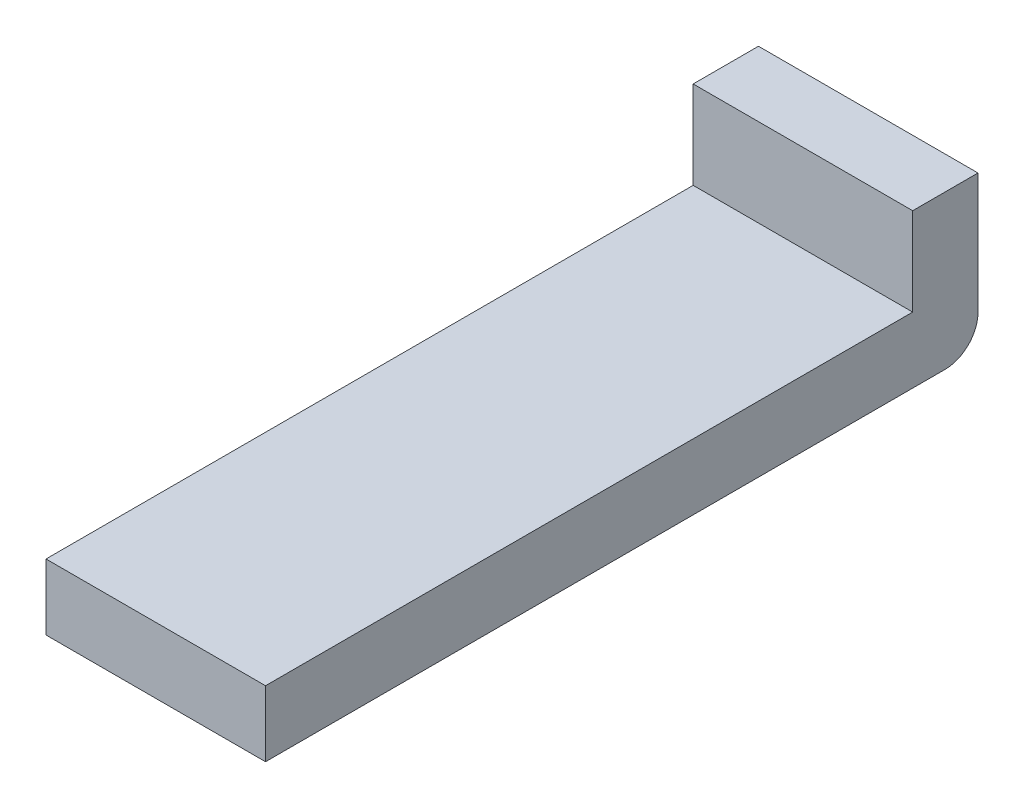
ISO-10303-21;
HEADER;
FILE_DESCRIPTION(('STEP AP214'),'2;1');
FILE_NAME('part.step','',(''),(''),'','','');
FILE_SCHEMA(('AUTOMOTIVE_DESIGN { 1 0 10303 214 1 1 1 1 }'));
ENDSEC;
DATA;
#1=APPLICATION_CONTEXT('core data for automotive mechanical design processes');
#2=APPLICATION_PROTOCOL_DEFINITION('international standard','automotive_design',2000,#1);
#3=PRODUCT_CONTEXT('',#1,'mechanical');
#4=PRODUCT('Part','Part','',(#3));
#5=PRODUCT_RELATED_PRODUCT_CATEGORY('part','',(#4));
#6=PRODUCT_DEFINITION_FORMATION('','',#4);
#7=PRODUCT_DEFINITION_CONTEXT('part definition',#1,'design');
#8=PRODUCT_DEFINITION('design','',#6,#7);
#9=PRODUCT_DEFINITION_SHAPE('','',#8);
#10=(LENGTH_UNIT() NAMED_UNIT(*) SI_UNIT(.MILLI.,.METRE.));
#11=(NAMED_UNIT(*) PLANE_ANGLE_UNIT() SI_UNIT($,.RADIAN.));
#12=(NAMED_UNIT(*) SI_UNIT($,.STERADIAN.) SOLID_ANGLE_UNIT());
#13=UNCERTAINTY_MEASURE_WITH_UNIT(LENGTH_MEASURE(1.E-05),#10,'distance_accuracy_value','');
#14=(GEOMETRIC_REPRESENTATION_CONTEXT(3) GLOBAL_UNCERTAINTY_ASSIGNED_CONTEXT((#13)) GLOBAL_UNIT_ASSIGNED_CONTEXT((#10,
#11,#12)) REPRESENTATION_CONTEXT('',''));
#15=CARTESIAN_POINT('',(0.,0.,0.));
#16=DIRECTION('',(0.,0.,1.));
#17=DIRECTION('',(1.,0.,0.));
#18=AXIS2_PLACEMENT_3D('',#15,#16,#17);
#19=CARTESIAN_POINT('',(-0.5,0.,1.9205));
#20=DIRECTION('',(0.,1.,0.));
#21=DIRECTION('',(1.,0.,0.));
#22=AXIS2_PLACEMENT_3D('',#19,#20,#21);
#23=PLANE('',#22);
#24=DIRECTION('',(-1.,0.,0.));
#25=VECTOR('',#24,1.);
#26=CARTESIAN_POINT('',(-0.5,0.,-1.175));
#27=LINE('',#26,#25);
#28=CARTESIAN_POINT('',(0.5,0.,-1.175));
#29=VERTEX_POINT('',#28);
#30=CARTESIAN_POINT('',(-0.5,0.,-1.175));
#31=VERTEX_POINT('',#30);
#32=EDGE_CURVE('E129',#29,#31,#27,.T.);
#33=ORIENTED_EDGE('',*,*,#32,.F.);
#34=DIRECTION('',(0.,0.,-1.));
#35=VECTOR('',#34,1.);
#36=CARTESIAN_POINT('',(0.5,0.,1.9205));
#37=LINE('',#36,#35);
#38=CARTESIAN_POINT('',(0.5,0.,1.9205));
#39=VERTEX_POINT('',#38);
#40=EDGE_CURVE('E42',#39,#29,#37,.T.);
#41=ORIENTED_EDGE('',*,*,#40,.F.);
#42=DIRECTION('',(1.,0.,0.));
#43=VECTOR('',#42,1.);
#44=CARTESIAN_POINT('',(-0.5,0.,1.9205));
#45=LINE('',#44,#43);
#46=CARTESIAN_POINT('',(-0.5,0.,1.9205));
#47=VERTEX_POINT('',#46);
#48=EDGE_CURVE('E136',#47,#39,#45,.T.);
#49=ORIENTED_EDGE('',*,*,#48,.F.);
#50=DIRECTION('',(0.,0.,1.));
#51=VECTOR('',#50,1.);
#52=CARTESIAN_POINT('',(-0.5,0.,1.9205));
#53=LINE('',#52,#51);
#54=EDGE_CURVE('E11',#31,#47,#53,.T.);
#55=ORIENTED_EDGE('',*,*,#54,.F.);
#56=EDGE_LOOP('',(#33,#41,#49,#55));
#57=FACE_BOUND('',#56,.T.);
#58=ADVANCED_FACE('F17',(#57),#23,.F.);
#59=CARTESIAN_POINT('',(-0.5,0.3,-1.325));
#60=DIRECTION('',(1.,0.,0.));
#61=DIRECTION('',(0.,0.,-1.));
#62=AXIS2_PLACEMENT_3D('',#59,#60,#61);
#63=PLANE('',#62);
#64=CARTESIAN_POINT('',(-0.5,0.15,-1.175));
#65=DIRECTION('',(1.,0.,0.));
#66=DIRECTION('',(0.,0.,1.));
#67=AXIS2_PLACEMENT_3D('',#64,#65,#66);
#68=CIRCLE('',#67,0.15);
#69=CARTESIAN_POINT('',(-0.5,0.15,-1.325));
#70=VERTEX_POINT('',#69);
#71=EDGE_CURVE('E28',#31,#70,#68,.T.);
#72=ORIENTED_EDGE('',*,*,#71,.F.);
#73=ORIENTED_EDGE('',*,*,#54,.T.);
#74=DIRECTION('',(0.,-1.,0.));
#75=VECTOR('',#74,1.);
#76=CARTESIAN_POINT('',(-0.5,0.3,1.9205));
#77=LINE('',#76,#75);
#78=CARTESIAN_POINT('',(-0.5,0.3,1.9205));
#79=VERTEX_POINT('',#78);
#80=EDGE_CURVE('E107',#79,#47,#77,.T.);
#81=ORIENTED_EDGE('',*,*,#80,.F.);
#82=DIRECTION('',(0.,0.,1.));
#83=VECTOR('',#82,1.);
#84=CARTESIAN_POINT('',(-0.5,0.3,-1.325));
#85=LINE('',#84,#83);
#86=CARTESIAN_POINT('',(-0.5,0.3,-1.027480569985));
#87=VERTEX_POINT('',#86);
#88=EDGE_CURVE('E86',#87,#79,#85,.T.);
#89=ORIENTED_EDGE('',*,*,#88,.F.);
#90=DIRECTION('',(0.,-1.,0.));
#91=VECTOR('',#90,1.);
#92=CARTESIAN_POINT('',(-0.5,0.3,-1.027480569985));
#93=LINE('',#92,#91);
#94=CARTESIAN_POINT('',(-0.5,0.7,-1.027480569985));
#95=VERTEX_POINT('',#94);
#96=EDGE_CURVE('E95',#95,#87,#93,.T.);
#97=ORIENTED_EDGE('',*,*,#96,.F.);
#98=DIRECTION('',(0.,0.,1.));
#99=VECTOR('',#98,1.);
#100=CARTESIAN_POINT('',(-0.5,0.7,-1.325));
#101=LINE('',#100,#99);
#102=CARTESIAN_POINT('',(-0.5,0.7,-1.325));
#103=VERTEX_POINT('',#102);
#104=EDGE_CURVE('E157',#103,#95,#101,.T.);
#105=ORIENTED_EDGE('',*,*,#104,.F.);
#106=DIRECTION('',(0.,1.,0.));
#107=VECTOR('',#106,1.);
#108=CARTESIAN_POINT('',(-0.5,0.3,-1.325));
#109=LINE('',#108,#107);
#110=EDGE_CURVE('E133',#70,#103,#109,.T.);
#111=ORIENTED_EDGE('',*,*,#110,.F.);
#112=EDGE_LOOP('',(#72,#73,#81,#89,#97,#105,#111));
#113=FACE_BOUND('',#112,.T.);
#114=ADVANCED_FACE('F105',(#113),#63,.F.);
#115=CARTESIAN_POINT('',(-0.5,0.15,-1.175));
#116=DIRECTION('',(-1.,0.,0.));
#117=DIRECTION('',(0.,0.,1.));
#118=AXIS2_PLACEMENT_3D('',#115,#116,#117);
#119=CYLINDRICAL_SURFACE('',#118,0.15);
#120=ORIENTED_EDGE('',*,*,#71,.T.);
#121=DIRECTION('',(1.,0.,0.));
#122=VECTOR('',#121,1.);
#123=CARTESIAN_POINT('',(-0.5,0.15,-1.325));
#124=LINE('',#123,#122);
#125=CARTESIAN_POINT('',(0.5,0.15,-1.325));
#126=VERTEX_POINT('',#125);
#127=EDGE_CURVE('E139',#70,#126,#124,.T.);
#128=ORIENTED_EDGE('',*,*,#127,.T.);
#129=CARTESIAN_POINT('',(0.5,0.15,-1.175));
#130=DIRECTION('',(-1.,0.,0.));
#131=DIRECTION('',(0.,0.,1.));
#132=AXIS2_PLACEMENT_3D('',#129,#130,#131);
#133=CIRCLE('',#132,0.15);
#134=EDGE_CURVE('E132',#126,#29,#133,.T.);
#135=ORIENTED_EDGE('',*,*,#134,.T.);
#136=ORIENTED_EDGE('',*,*,#32,.T.);
#137=EDGE_LOOP('',(#120,#128,#135,#136));
#138=FACE_BOUND('',#137,.T.);
#139=ADVANCED_FACE('F196',(#138),#119,.T.);
#140=CARTESIAN_POINT('',(0.5,0.3,-1.325));
#141=DIRECTION('',(-1.,0.,0.));
#142=DIRECTION('',(0.,1.,0.));
#143=AXIS2_PLACEMENT_3D('',#140,#141,#142);
#144=PLANE('',#143);
#145=ORIENTED_EDGE('',*,*,#134,.F.);
#146=DIRECTION('',(0.,-1.,0.));
#147=VECTOR('',#146,1.);
#148=CARTESIAN_POINT('',(0.5,0.3,-1.325));
#149=LINE('',#148,#147);
#150=CARTESIAN_POINT('',(0.5,0.7,-1.325));
#151=VERTEX_POINT('',#150);
#152=EDGE_CURVE('E125',#151,#126,#149,.T.);
#153=ORIENTED_EDGE('',*,*,#152,.F.);
#154=DIRECTION('',(0.,0.,-1.));
#155=VECTOR('',#154,1.);
#156=CARTESIAN_POINT('',(0.5,0.7,-1.325));
#157=LINE('',#156,#155);
#158=CARTESIAN_POINT('',(0.5,0.7,-1.027480569985));
#159=VERTEX_POINT('',#158);
#160=EDGE_CURVE('E102',#159,#151,#157,.T.);
#161=ORIENTED_EDGE('',*,*,#160,.F.);
#162=DIRECTION('',(0.,1.,0.));
#163=VECTOR('',#162,1.);
#164=CARTESIAN_POINT('',(0.5,0.3,-1.027480569985));
#165=LINE('',#164,#163);
#166=CARTESIAN_POINT('',(0.5,0.3,-1.027480569985));
#167=VERTEX_POINT('',#166);
#168=EDGE_CURVE('E101',#167,#159,#165,.T.);
#169=ORIENTED_EDGE('',*,*,#168,.F.);
#170=DIRECTION('',(0.,0.,-1.));
#171=VECTOR('',#170,1.);
#172=CARTESIAN_POINT('',(0.5,0.3,-1.325));
#173=LINE('',#172,#171);
#174=CARTESIAN_POINT('',(0.5,0.3,1.9205));
#175=VERTEX_POINT('',#174);
#176=EDGE_CURVE('E114',#175,#167,#173,.T.);
#177=ORIENTED_EDGE('',*,*,#176,.F.);
#178=DIRECTION('',(0.,1.,0.));
#179=VECTOR('',#178,1.);
#180=CARTESIAN_POINT('',(0.5,0.3,1.9205));
#181=LINE('',#180,#179);
#182=EDGE_CURVE('E163',#39,#175,#181,.T.);
#183=ORIENTED_EDGE('',*,*,#182,.F.);
#184=ORIENTED_EDGE('',*,*,#40,.T.);
#185=EDGE_LOOP('',(#145,#153,#161,#169,#177,#183,#184));
#186=FACE_BOUND('',#185,.T.);
#187=ADVANCED_FACE('F192',(#186),#144,.F.);
#188=CARTESIAN_POINT('',(-0.5,0.3,1.9205));
#189=DIRECTION('',(0.,0.,-1.));
#190=DIRECTION('',(0.,-1.,0.));
#191=AXIS2_PLACEMENT_3D('',#188,#189,#190);
#192=PLANE('',#191);
#193=ORIENTED_EDGE('',*,*,#182,.T.);
#194=DIRECTION('',(1.,0.,0.));
#195=VECTOR('',#194,1.);
#196=CARTESIAN_POINT('',(-0.5,0.3,1.9205));
#197=LINE('',#196,#195);
#198=EDGE_CURVE('E120',#79,#175,#197,.T.);
#199=ORIENTED_EDGE('',*,*,#198,.F.);
#200=ORIENTED_EDGE('',*,*,#80,.T.);
#201=ORIENTED_EDGE('',*,*,#48,.T.);
#202=EDGE_LOOP('',(#193,#199,#200,#201));
#203=FACE_BOUND('',#202,.T.);
#204=ADVANCED_FACE('F221',(#203),#192,.F.);
#205=CARTESIAN_POINT('',(-0.5,0.3,-1.325));
#206=DIRECTION('',(0.,0.,1.));
#207=DIRECTION('',(1.,0.,0.));
#208=AXIS2_PLACEMENT_3D('',#205,#206,#207);
#209=PLANE('',#208);
#210=ORIENTED_EDGE('',*,*,#127,.F.);
#211=ORIENTED_EDGE('',*,*,#110,.T.);
#212=DIRECTION('',(-1.,0.,0.));
#213=VECTOR('',#212,1.);
#214=CARTESIAN_POINT('',(-0.5,0.7,-1.325));
#215=LINE('',#214,#213);
#216=EDGE_CURVE('E160',#151,#103,#215,.T.);
#217=ORIENTED_EDGE('',*,*,#216,.F.);
#218=ORIENTED_EDGE('',*,*,#152,.T.);
#219=EDGE_LOOP('',(#210,#211,#217,#218));
#220=FACE_BOUND('',#219,.T.);
#221=ADVANCED_FACE('F194',(#220),#209,.F.);
#222=CARTESIAN_POINT('',(-0.5,0.3,1.9205));
#223=DIRECTION('',(0.,1.,0.));
#224=DIRECTION('',(1.,0.,0.));
#225=AXIS2_PLACEMENT_3D('',#222,#223,#224);
#226=PLANE('',#225);
#227=ORIENTED_EDGE('',*,*,#198,.T.);
#228=ORIENTED_EDGE('',*,*,#176,.T.);
#229=DIRECTION('',(-1.,0.,0.));
#230=VECTOR('',#229,1.);
#231=CARTESIAN_POINT('',(-0.5,0.3,-1.027480569985));
#232=LINE('',#231,#230);
#233=EDGE_CURVE('E21',#167,#87,#232,.T.);
#234=ORIENTED_EDGE('',*,*,#233,.T.);
#235=ORIENTED_EDGE('',*,*,#88,.T.);
#236=EDGE_LOOP('',(#227,#228,#234,#235));
#237=FACE_BOUND('',#236,.T.);
#238=ADVANCED_FACE('F112',(#237),#226,.T.);
#239=CARTESIAN_POINT('',(-0.5,0.7,-1.027480569985));
#240=DIRECTION('',(0.,0.,-1.));
#241=DIRECTION('',(0.,-1.,0.));
#242=AXIS2_PLACEMENT_3D('',#239,#240,#241);
#243=PLANE('',#242);
#244=ORIENTED_EDGE('',*,*,#168,.T.);
#245=DIRECTION('',(1.,0.,0.));
#246=VECTOR('',#245,1.);
#247=CARTESIAN_POINT('',(-0.5,0.7,-1.027480569985));
#248=LINE('',#247,#246);
#249=EDGE_CURVE('E98',#95,#159,#248,.T.);
#250=ORIENTED_EDGE('',*,*,#249,.F.);
#251=ORIENTED_EDGE('',*,*,#96,.T.);
#252=ORIENTED_EDGE('',*,*,#233,.F.);
#253=EDGE_LOOP('',(#244,#250,#251,#252));
#254=FACE_BOUND('',#253,.T.);
#255=ADVANCED_FACE('F19',(#254),#243,.F.);
#256=CARTESIAN_POINT('',(-0.5,0.7,-1.027480569985));
#257=DIRECTION('',(0.,1.,0.));
#258=DIRECTION('',(1.,0.,0.));
#259=AXIS2_PLACEMENT_3D('',#256,#257,#258);
#260=PLANE('',#259);
#261=ORIENTED_EDGE('',*,*,#160,.T.);
#262=ORIENTED_EDGE('',*,*,#216,.T.);
#263=ORIENTED_EDGE('',*,*,#104,.T.);
#264=ORIENTED_EDGE('',*,*,#249,.T.);
#265=EDGE_LOOP('',(#261,#262,#263,#264));
#266=FACE_BOUND('',#265,.T.);
#267=ADVANCED_FACE('F190',(#266),#260,.T.);
#268=CLOSED_SHELL('',(#58,#114,#139,#187,#204,#221,#238,#255,#267));
#269=MANIFOLD_SOLID_BREP('B1',#268);
#270=ADVANCED_BREP_SHAPE_REPRESENTATION('',(#18,#269),#14);
#271=SHAPE_DEFINITION_REPRESENTATION(#9,#270);
ENDSEC;
END-ISO-10303-21;
